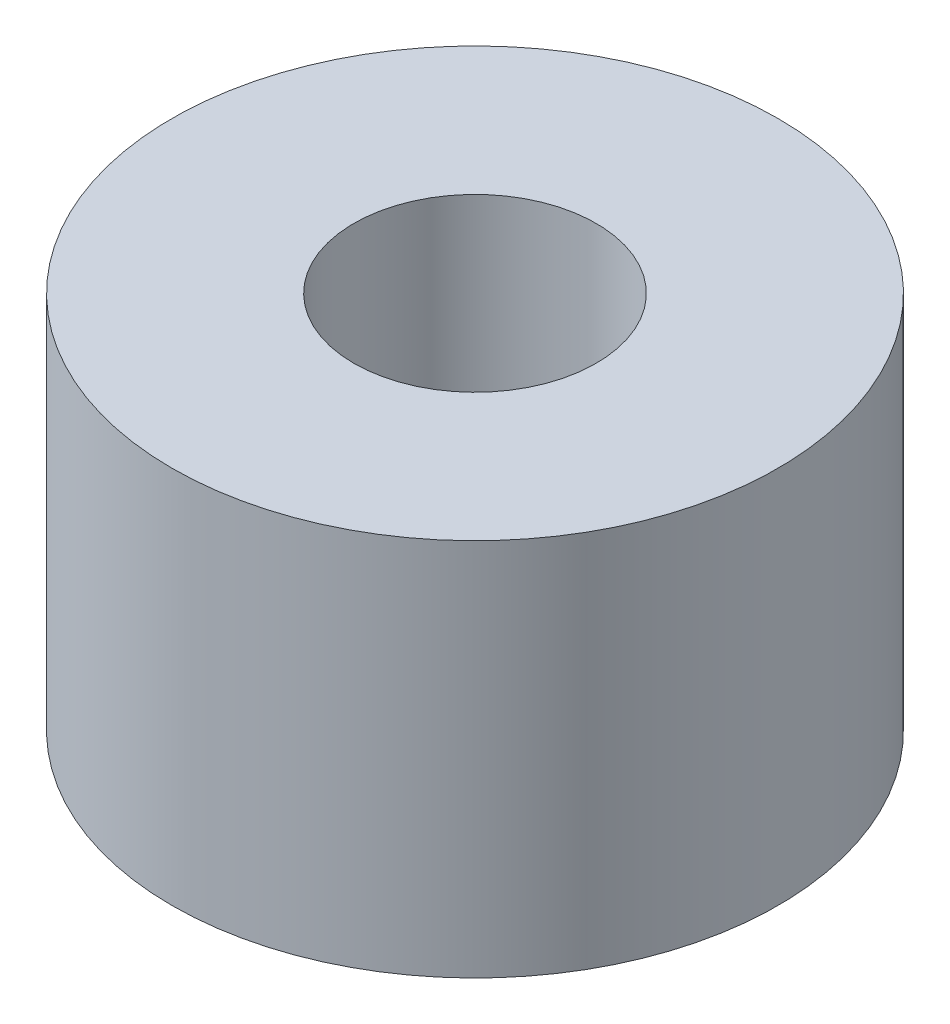
ISO-10303-21;
HEADER;
FILE_DESCRIPTION(('STEP AP214'),'2;1');
FILE_NAME('part.step','',(''),(''),'','','');
FILE_SCHEMA(('AUTOMOTIVE_DESIGN { 1 0 10303 214 1 1 1 1 }'));
ENDSEC;
DATA;
#1=APPLICATION_CONTEXT('core data for automotive mechanical design processes');
#2=APPLICATION_PROTOCOL_DEFINITION('international standard','automotive_design',2000,#1);
#3=PRODUCT_CONTEXT('',#1,'mechanical');
#4=PRODUCT('Part','Part','',(#3));
#5=PRODUCT_RELATED_PRODUCT_CATEGORY('part','',(#4));
#6=PRODUCT_DEFINITION_FORMATION('','',#4);
#7=PRODUCT_DEFINITION_CONTEXT('part definition',#1,'design');
#8=PRODUCT_DEFINITION('design','',#6,#7);
#9=PRODUCT_DEFINITION_SHAPE('','',#8);
#10=(LENGTH_UNIT() NAMED_UNIT(*) SI_UNIT(.MILLI.,.METRE.));
#11=(NAMED_UNIT(*) PLANE_ANGLE_UNIT() SI_UNIT($,.RADIAN.));
#12=(NAMED_UNIT(*) SI_UNIT($,.STERADIAN.) SOLID_ANGLE_UNIT());
#13=UNCERTAINTY_MEASURE_WITH_UNIT(LENGTH_MEASURE(1.E-05),#10,'distance_accuracy_value','');
#14=(GEOMETRIC_REPRESENTATION_CONTEXT(3) GLOBAL_UNCERTAINTY_ASSIGNED_CONTEXT((#13)) GLOBAL_UNIT_ASSIGNED_CONTEXT((#10,
#11,#12)) REPRESENTATION_CONTEXT('',''));
#15=CARTESIAN_POINT('',(0.,0.,0.));
#16=DIRECTION('',(0.,0.,1.));
#17=DIRECTION('',(1.,0.,0.));
#18=AXIS2_PLACEMENT_3D('',#15,#16,#17);
#19=CARTESIAN_POINT('',(0.,5.,0.));
#20=DIRECTION('',(0.,1.,0.));
#21=DIRECTION('',(0.,0.,1.));
#22=AXIS2_PLACEMENT_3D('',#19,#20,#21);
#23=PLANE('',#22);
#24=CARTESIAN_POINT('',(0.,5.,0.));
#25=DIRECTION('',(0.,1.,0.));
#26=DIRECTION('',(0.,0.,1.));
#27=AXIS2_PLACEMENT_3D('',#24,#25,#26);
#28=CIRCLE('',#27,4.);
#29=CARTESIAN_POINT('',(0.,5.,4.));
#30=VERTEX_POINT('',#29);
#31=EDGE_CURVE('E10',#30,#30,#28,.T.);
#32=ORIENTED_EDGE('',*,*,#31,.T.);
#33=EDGE_LOOP('',(#32));
#34=FACE_BOUND('',#33,.T.);
#35=CARTESIAN_POINT('',(0.,5.,0.));
#36=DIRECTION('',(0.,1.,0.));
#37=DIRECTION('',(0.,0.,1.));
#38=AXIS2_PLACEMENT_3D('',#35,#36,#37);
#39=CIRCLE('',#38,1.6);
#40=CARTESIAN_POINT('',(0.,5.,1.6));
#41=VERTEX_POINT('',#40);
#42=EDGE_CURVE('E52',#41,#41,#39,.T.);
#43=ORIENTED_EDGE('',*,*,#42,.F.);
#44=EDGE_LOOP('',(#43));
#45=FACE_BOUND('',#44,.T.);
#46=ADVANCED_FACE('F41',(#34,#45),#23,.T.);
#47=CARTESIAN_POINT('',(0.,0.,0.));
#48=DIRECTION('',(0.,1.,0.));
#49=DIRECTION('',(0.,0.,1.));
#50=AXIS2_PLACEMENT_3D('',#47,#48,#49);
#51=PLANE('',#50);
#52=CARTESIAN_POINT('',(0.,0.,0.));
#53=DIRECTION('',(0.,1.,0.));
#54=DIRECTION('',(0.,0.,1.));
#55=AXIS2_PLACEMENT_3D('',#52,#53,#54);
#56=CIRCLE('',#55,4.);
#57=CARTESIAN_POINT('',(0.,0.,4.));
#58=VERTEX_POINT('',#57);
#59=EDGE_CURVE('E45',#58,#58,#56,.T.);
#60=ORIENTED_EDGE('',*,*,#59,.F.);
#61=EDGE_LOOP('',(#60));
#62=FACE_BOUND('',#61,.T.);
#63=CARTESIAN_POINT('',(0.,0.,0.));
#64=DIRECTION('',(0.,1.,0.));
#65=DIRECTION('',(0.,0.,1.));
#66=AXIS2_PLACEMENT_3D('',#63,#64,#65);
#67=CIRCLE('',#66,1.6);
#68=CARTESIAN_POINT('',(0.,0.,1.6));
#69=VERTEX_POINT('',#68);
#70=EDGE_CURVE('E54',#69,#69,#67,.T.);
#71=ORIENTED_EDGE('',*,*,#70,.T.);
#72=EDGE_LOOP('',(#71));
#73=FACE_BOUND('',#72,.T.);
#74=ADVANCED_FACE('F64',(#62,#73),#51,.F.);
#75=CARTESIAN_POINT('',(0.,5.,0.));
#76=DIRECTION('',(0.,-1.,0.));
#77=DIRECTION('',(0.,0.,-1.));
#78=AXIS2_PLACEMENT_3D('',#75,#76,#77);
#79=CYLINDRICAL_SURFACE('',#78,4.);
#80=ORIENTED_EDGE('',*,*,#31,.F.);
#81=EDGE_LOOP('',(#80));
#82=FACE_BOUND('',#81,.T.);
#83=ORIENTED_EDGE('',*,*,#59,.T.);
#84=EDGE_LOOP('',(#83));
#85=FACE_BOUND('',#84,.T.);
#86=ADVANCED_FACE('F43',(#82,#85),#79,.T.);
#87=CARTESIAN_POINT('',(0.,5.,0.));
#88=DIRECTION('',(0.,-1.,0.));
#89=DIRECTION('',(0.,0.,-1.));
#90=AXIS2_PLACEMENT_3D('',#87,#88,#89);
#91=CYLINDRICAL_SURFACE('',#90,1.6);
#92=ORIENTED_EDGE('',*,*,#42,.T.);
#93=EDGE_LOOP('',(#92));
#94=FACE_BOUND('',#93,.T.);
#95=ORIENTED_EDGE('',*,*,#70,.F.);
#96=EDGE_LOOP('',(#95));
#97=FACE_BOUND('',#96,.T.);
#98=ADVANCED_FACE('F60',(#94,#97),#91,.F.);
#99=CLOSED_SHELL('',(#46,#74,#86,#98));
#100=MANIFOLD_SOLID_BREP('B2',#99);
#101=ADVANCED_BREP_SHAPE_REPRESENTATION('',(#18,#100),#14);
#102=SHAPE_DEFINITION_REPRESENTATION(#9,#101);
ENDSEC;
END-ISO-10303-21;
